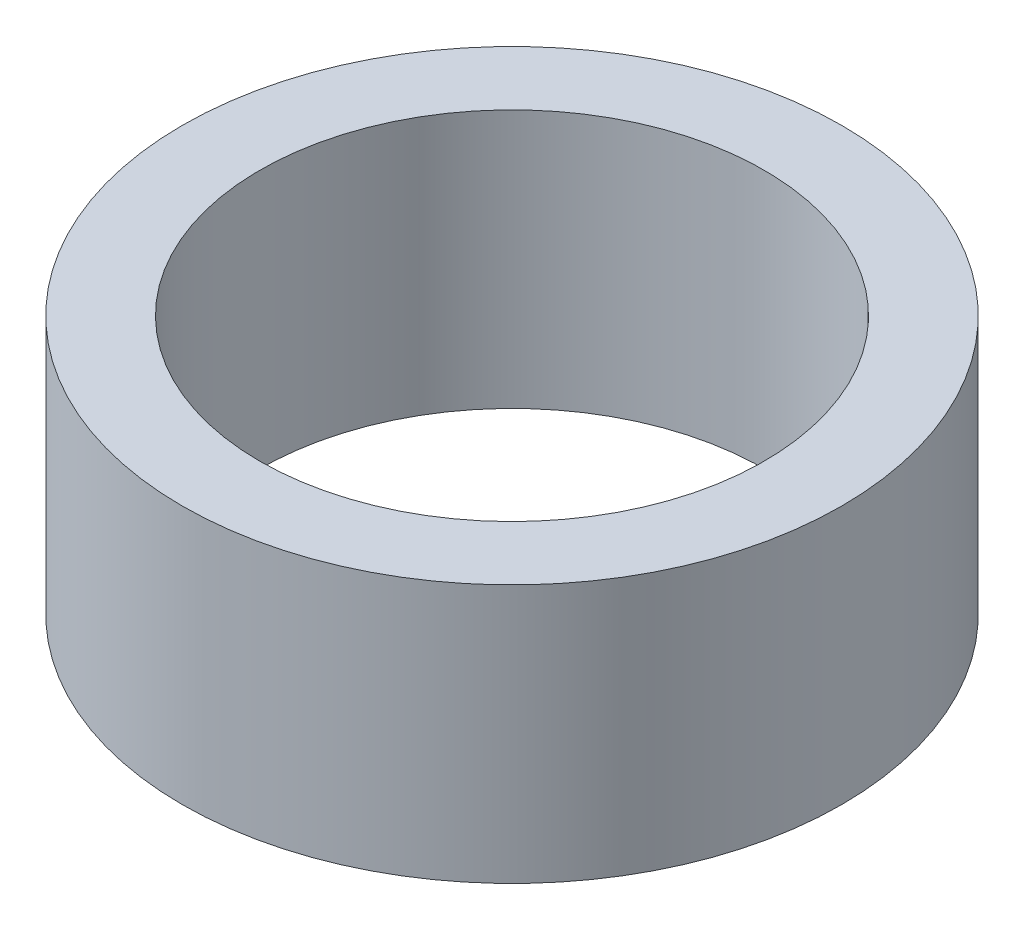
ISO-10303-21;
HEADER;
FILE_DESCRIPTION(('STEP AP214'),'2;1');
FILE_NAME('part.step','',(''),(''),'','','');
FILE_SCHEMA(('AUTOMOTIVE_DESIGN { 1 0 10303 214 1 1 1 1 }'));
ENDSEC;
DATA;
#1=APPLICATION_CONTEXT('core data for automotive mechanical design processes');
#2=APPLICATION_PROTOCOL_DEFINITION('international standard','automotive_design',2000,#1);
#3=PRODUCT_CONTEXT('',#1,'mechanical');
#4=PRODUCT('Part','Part','',(#3));
#5=PRODUCT_RELATED_PRODUCT_CATEGORY('part','',(#4));
#6=PRODUCT_DEFINITION_FORMATION('','',#4);
#7=PRODUCT_DEFINITION_CONTEXT('part definition',#1,'design');
#8=PRODUCT_DEFINITION('design','',#6,#7);
#9=PRODUCT_DEFINITION_SHAPE('','',#8);
#10=(LENGTH_UNIT() NAMED_UNIT(*) SI_UNIT(.MILLI.,.METRE.));
#11=(NAMED_UNIT(*) PLANE_ANGLE_UNIT() SI_UNIT($,.RADIAN.));
#12=(NAMED_UNIT(*) SI_UNIT($,.STERADIAN.) SOLID_ANGLE_UNIT());
#13=UNCERTAINTY_MEASURE_WITH_UNIT(LENGTH_MEASURE(1.E-05),#10,'distance_accuracy_value','');
#14=(GEOMETRIC_REPRESENTATION_CONTEXT(3) GLOBAL_UNCERTAINTY_ASSIGNED_CONTEXT((#13)) GLOBAL_UNIT_ASSIGNED_CONTEXT((#10,
#11,#12)) REPRESENTATION_CONTEXT('',''));
#15=CARTESIAN_POINT('',(0.,0.,0.));
#16=DIRECTION('',(0.,0.,1.));
#17=DIRECTION('',(1.,0.,0.));
#18=AXIS2_PLACEMENT_3D('',#15,#16,#17);
#19=CARTESIAN_POINT('',(0.,10.,0.));
#20=DIRECTION('',(0.,1.,0.));
#21=DIRECTION('',(0.,0.,1.));
#22=AXIS2_PLACEMENT_3D('',#19,#20,#21);
#23=PLANE('',#22);
#24=CARTESIAN_POINT('',(0.,10.,0.));
#25=DIRECTION('',(0.,1.,0.));
#26=DIRECTION('',(0.,0.,1.));
#27=AXIS2_PLACEMENT_3D('',#24,#25,#26);
#28=CIRCLE('',#27,12.75);
#29=CARTESIAN_POINT('',(0.,10.,12.75));
#30=VERTEX_POINT('',#29);
#31=EDGE_CURVE('E10',#30,#30,#28,.T.);
#32=ORIENTED_EDGE('',*,*,#31,.T.);
#33=EDGE_LOOP('',(#32));
#34=FACE_BOUND('',#33,.T.);
#35=CARTESIAN_POINT('',(0.,10.,0.));
#36=DIRECTION('',(0.,1.,0.));
#37=DIRECTION('',(0.,0.,1.));
#38=AXIS2_PLACEMENT_3D('',#35,#36,#37);
#39=CIRCLE('',#38,9.75);
#40=CARTESIAN_POINT('',(0.,10.,9.75));
#41=VERTEX_POINT('',#40);
#42=EDGE_CURVE('E54',#41,#41,#39,.T.);
#43=ORIENTED_EDGE('',*,*,#42,.F.);
#44=EDGE_LOOP('',(#43));
#45=FACE_BOUND('',#44,.T.);
#46=ADVANCED_FACE('F41',(#34,#45),#23,.T.);
#47=CARTESIAN_POINT('',(0.,0.,0.));
#48=DIRECTION('',(0.,1.,0.));
#49=DIRECTION('',(0.,0.,1.));
#50=AXIS2_PLACEMENT_3D('',#47,#48,#49);
#51=PLANE('',#50);
#52=CARTESIAN_POINT('',(0.,0.,0.));
#53=DIRECTION('',(0.,1.,0.));
#54=DIRECTION('',(0.,0.,1.));
#55=AXIS2_PLACEMENT_3D('',#52,#53,#54);
#56=CIRCLE('',#55,12.75);
#57=CARTESIAN_POINT('',(0.,0.,12.75));
#58=VERTEX_POINT('',#57);
#59=EDGE_CURVE('E45',#58,#58,#56,.T.);
#60=ORIENTED_EDGE('',*,*,#59,.F.);
#61=EDGE_LOOP('',(#60));
#62=FACE_BOUND('',#61,.T.);
#63=CARTESIAN_POINT('',(0.,0.,0.));
#64=DIRECTION('',(0.,1.,0.));
#65=DIRECTION('',(0.,0.,1.));
#66=AXIS2_PLACEMENT_3D('',#63,#64,#65);
#67=CIRCLE('',#66,9.75);
#68=CARTESIAN_POINT('',(0.,0.,9.75));
#69=VERTEX_POINT('',#68);
#70=EDGE_CURVE('E56',#69,#69,#67,.T.);
#71=ORIENTED_EDGE('',*,*,#70,.T.);
#72=EDGE_LOOP('',(#71));
#73=FACE_BOUND('',#72,.T.);
#74=ADVANCED_FACE('F68',(#62,#73),#51,.F.);
#75=CARTESIAN_POINT('',(0.,10.,0.));
#76=DIRECTION('',(0.,-1.,0.));
#77=DIRECTION('',(0.,0.,-1.));
#78=AXIS2_PLACEMENT_3D('',#75,#76,#77);
#79=CYLINDRICAL_SURFACE('',#78,12.75);
#80=ORIENTED_EDGE('',*,*,#31,.F.);
#81=EDGE_LOOP('',(#80));
#82=FACE_BOUND('',#81,.T.);
#83=ORIENTED_EDGE('',*,*,#59,.T.);
#84=EDGE_LOOP('',(#83));
#85=FACE_BOUND('',#84,.T.);
#86=ADVANCED_FACE('F43',(#82,#85),#79,.T.);
#87=CARTESIAN_POINT('',(0.,10.,0.));
#88=DIRECTION('',(0.,-1.,0.));
#89=DIRECTION('',(0.,0.,-1.));
#90=AXIS2_PLACEMENT_3D('',#87,#88,#89);
#91=CYLINDRICAL_SURFACE('',#90,9.75);
#92=ORIENTED_EDGE('',*,*,#42,.T.);
#93=EDGE_LOOP('',(#92));
#94=FACE_BOUND('',#93,.T.);
#95=ORIENTED_EDGE('',*,*,#70,.F.);
#96=EDGE_LOOP('',(#95));
#97=FACE_BOUND('',#96,.T.);
#98=ADVANCED_FACE('F64',(#94,#97),#91,.F.);
#99=CLOSED_SHELL('',(#46,#74,#86,#98));
#100=MANIFOLD_SOLID_BREP('B2',#99);
#101=ADVANCED_BREP_SHAPE_REPRESENTATION('',(#18,#100),#14);
#102=SHAPE_DEFINITION_REPRESENTATION(#9,#101);
ENDSEC;
END-ISO-10303-21;
